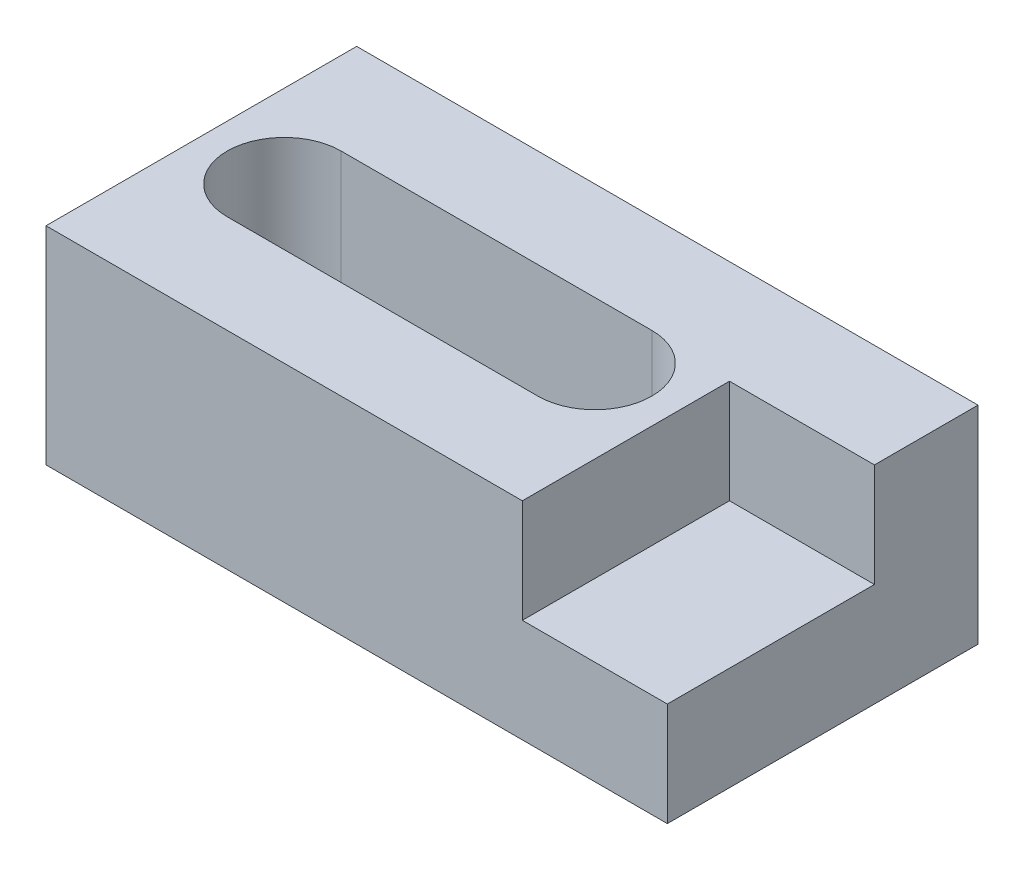
ISO-10303-21;
HEADER;
FILE_DESCRIPTION(('STEP AP214'),'2;1');
FILE_NAME('part.step','',(''),(''),'','','');
FILE_SCHEMA(('AUTOMOTIVE_DESIGN { 1 0 10303 214 1 1 1 1 }'));
ENDSEC;
DATA;
#1=APPLICATION_CONTEXT('core data for automotive mechanical design processes');
#2=APPLICATION_PROTOCOL_DEFINITION('international standard','automotive_design',2000,#1);
#3=PRODUCT_CONTEXT('',#1,'mechanical');
#4=PRODUCT('Part','Part','',(#3));
#5=PRODUCT_RELATED_PRODUCT_CATEGORY('part','',(#4));
#6=PRODUCT_DEFINITION_FORMATION('','',#4);
#7=PRODUCT_DEFINITION_CONTEXT('part definition',#1,'design');
#8=PRODUCT_DEFINITION('design','',#6,#7);
#9=PRODUCT_DEFINITION_SHAPE('','',#8);
#10=(LENGTH_UNIT() NAMED_UNIT(*) SI_UNIT(.MILLI.,.METRE.));
#11=(NAMED_UNIT(*) PLANE_ANGLE_UNIT() SI_UNIT($,.RADIAN.));
#12=(NAMED_UNIT(*) SI_UNIT($,.STERADIAN.) SOLID_ANGLE_UNIT());
#13=UNCERTAINTY_MEASURE_WITH_UNIT(LENGTH_MEASURE(1.E-05),#10,'distance_accuracy_value','');
#14=(GEOMETRIC_REPRESENTATION_CONTEXT(3) GLOBAL_UNCERTAINTY_ASSIGNED_CONTEXT((#13)) GLOBAL_UNIT_ASSIGNED_CONTEXT((#10,
#11,#12)) REPRESENTATION_CONTEXT('',''));
#15=CARTESIAN_POINT('',(0.,0.,0.));
#16=DIRECTION('',(0.,0.,1.));
#17=DIRECTION('',(1.,0.,0.));
#18=AXIS2_PLACEMENT_3D('',#15,#16,#17);
#19=CARTESIAN_POINT('',(15.,5.,-7.5));
#20=DIRECTION('',(0.,-1.,0.));
#21=DIRECTION('',(1.,0.,0.));
#22=AXIS2_PLACEMENT_3D('',#19,#20,#21);
#23=PLANE('',#22);
#24=DIRECTION('',(1.,0.,0.));
#25=VECTOR('',#24,1.);
#26=CARTESIAN_POINT('',(15.,5.,-2.5));
#27=LINE('',#26,#25);
#28=CARTESIAN_POINT('',(8.,5.,-2.5));
#29=VERTEX_POINT('',#28);
#30=CARTESIAN_POINT('',(15.,5.,-2.5));
#31=VERTEX_POINT('',#30);
#32=EDGE_CURVE('E53',#29,#31,#27,.T.);
#33=ORIENTED_EDGE('',*,*,#32,.F.);
#34=DIRECTION('',(0.,0.,1.));
#35=VECTOR('',#34,1.);
#36=CARTESIAN_POINT('',(8.,5.,-7.5));
#37=LINE('',#36,#35);
#38=CARTESIAN_POINT('',(8.,5.,7.5));
#39=VERTEX_POINT('',#38);
#40=EDGE_CURVE('E127',#29,#39,#37,.T.);
#41=ORIENTED_EDGE('',*,*,#40,.T.);
#42=DIRECTION('',(-1.,0.,0.));
#43=VECTOR('',#42,1.);
#44=CARTESIAN_POINT('',(-15.,5.,7.5));
#45=LINE('',#44,#43);
#46=CARTESIAN_POINT('',(15.,5.,7.5));
#47=VERTEX_POINT('',#46);
#48=EDGE_CURVE('E11',#47,#39,#45,.T.);
#49=ORIENTED_EDGE('',*,*,#48,.F.);
#50=DIRECTION('',(0.,0.,1.));
#51=VECTOR('',#50,1.);
#52=CARTESIAN_POINT('',(15.,5.,-7.5));
#53=LINE('',#52,#51);
#54=EDGE_CURVE('E48',#31,#47,#53,.T.);
#55=ORIENTED_EDGE('',*,*,#54,.F.);
#56=EDGE_LOOP('',(#33,#41,#49,#55));
#57=FACE_BOUND('',#56,.T.);
#58=ADVANCED_FACE('F33',(#57),#23,.F.);
#59=CARTESIAN_POINT('',(8.,10.,-7.5));
#60=DIRECTION('',(-1.,0.,0.));
#61=DIRECTION('',(0.,0.,1.));
#62=AXIS2_PLACEMENT_3D('',#59,#60,#61);
#63=PLANE('',#62);
#64=DIRECTION('',(0.,-1.,0.));
#65=VECTOR('',#64,1.);
#66=CARTESIAN_POINT('',(8.,18.6023252670426,-2.5));
#67=LINE('',#66,#65);
#68=CARTESIAN_POINT('',(8.,10.,-2.5));
#69=VERTEX_POINT('',#68);
#70=EDGE_CURVE('E131',#69,#29,#67,.T.);
#71=ORIENTED_EDGE('',*,*,#70,.F.);
#72=DIRECTION('',(0.,0.,1.));
#73=VECTOR('',#72,1.);
#74=CARTESIAN_POINT('',(8.,10.,-7.5));
#75=LINE('',#74,#73);
#76=CARTESIAN_POINT('',(8.,10.,7.5));
#77=VERTEX_POINT('',#76);
#78=EDGE_CURVE('E114',#69,#77,#75,.T.);
#79=ORIENTED_EDGE('',*,*,#78,.T.);
#80=DIRECTION('',(0.,1.,0.));
#81=VECTOR('',#80,1.);
#82=CARTESIAN_POINT('',(8.,10.,7.5));
#83=LINE('',#82,#81);
#84=EDGE_CURVE('E41',#39,#77,#83,.T.);
#85=ORIENTED_EDGE('',*,*,#84,.F.);
#86=ORIENTED_EDGE('',*,*,#40,.F.);
#87=EDGE_LOOP('',(#71,#79,#85,#86));
#88=FACE_BOUND('',#87,.T.);
#89=ADVANCED_FACE('F132',(#88),#63,.F.);
#90=CARTESIAN_POINT('',(0.,10.,0.));
#91=DIRECTION('',(0.,-1.,0.));
#92=DIRECTION('',(0.,0.,-1.));
#93=AXIS2_PLACEMENT_3D('',#90,#91,#92);
#94=PLANE('',#93);
#95=DIRECTION('',(1.,0.,0.));
#96=VECTOR('',#95,1.);
#97=CARTESIAN_POINT('',(-15.,10.,7.5));
#98=LINE('',#97,#96);
#99=CARTESIAN_POINT('',(-15.,10.,7.5));
#100=VERTEX_POINT('',#99);
#101=EDGE_CURVE('E123',#100,#77,#98,.T.);
#102=ORIENTED_EDGE('',*,*,#101,.T.);
#103=ORIENTED_EDGE('',*,*,#78,.F.);
#104=DIRECTION('',(-1.,0.,0.));
#105=VECTOR('',#104,1.);
#106=CARTESIAN_POINT('',(15.,10.,-2.5));
#107=LINE('',#106,#105);
#108=CARTESIAN_POINT('',(15.,10.,-2.5));
#109=VERTEX_POINT('',#108);
#110=EDGE_CURVE('E120',#109,#69,#107,.T.);
#111=ORIENTED_EDGE('',*,*,#110,.F.);
#112=DIRECTION('',(0.,0.,1.));
#113=VECTOR('',#112,1.);
#114=CARTESIAN_POINT('',(15.,10.,-7.5));
#115=LINE('',#114,#113);
#116=CARTESIAN_POINT('',(15.,10.,-7.5));
#117=VERTEX_POINT('',#116);
#118=EDGE_CURVE('E128',#117,#109,#115,.T.);
#119=ORIENTED_EDGE('',*,*,#118,.F.);
#120=DIRECTION('',(-1.,0.,0.));
#121=VECTOR('',#120,1.);
#122=CARTESIAN_POINT('',(-15.,10.,-7.5));
#123=LINE('',#122,#121);
#124=CARTESIAN_POINT('',(-15.,10.,-7.5));
#125=VERTEX_POINT('',#124);
#126=EDGE_CURVE('E176',#117,#125,#123,.T.);
#127=ORIENTED_EDGE('',*,*,#126,.T.);
#128=DIRECTION('',(0.,0.,1.));
#129=VECTOR('',#128,1.);
#130=CARTESIAN_POINT('',(-15.,10.,7.5));
#131=LINE('',#130,#129);
#132=EDGE_CURVE('E178',#125,#100,#131,.T.);
#133=ORIENTED_EDGE('',*,*,#132,.T.);
#134=EDGE_LOOP('',(#102,#103,#111,#119,#127,#133));
#135=FACE_BOUND('',#134,.T.);
#136=CARTESIAN_POINT('',(-11.,10.,0.));
#137=DIRECTION('',(0.,1.,0.));
#138=DIRECTION('',(0.,0.,1.));
#139=AXIS2_PLACEMENT_3D('',#136,#137,#138);
#140=CIRCLE('',#139,2.75);
#141=CARTESIAN_POINT('',(-11.,10.,-2.75));
#142=VERTEX_POINT('',#141);
#143=CARTESIAN_POINT('',(-11.,10.,2.75));
#144=VERTEX_POINT('',#143);
#145=EDGE_CURVE('E145',#142,#144,#140,.T.);
#146=ORIENTED_EDGE('',*,*,#145,.F.);
#147=DIRECTION('',(-1.,0.,0.));
#148=VECTOR('',#147,1.);
#149=CARTESIAN_POINT('',(-11.,10.,-2.75));
#150=LINE('',#149,#148);
#151=CARTESIAN_POINT('',(4.,10.,-2.75));
#152=VERTEX_POINT('',#151);
#153=EDGE_CURVE('E153',#152,#142,#150,.T.);
#154=ORIENTED_EDGE('',*,*,#153,.F.);
#155=CARTESIAN_POINT('',(4.,10.,0.));
#156=DIRECTION('',(0.,1.,0.));
#157=DIRECTION('',(0.,0.,1.));
#158=AXIS2_PLACEMENT_3D('',#155,#156,#157);
#159=CIRCLE('',#158,2.75);
#160=CARTESIAN_POINT('',(4.,10.,2.75));
#161=VERTEX_POINT('',#160);
#162=EDGE_CURVE('E150',#161,#152,#159,.T.);
#163=ORIENTED_EDGE('',*,*,#162,.F.);
#164=DIRECTION('',(1.,0.,0.));
#165=VECTOR('',#164,1.);
#166=CARTESIAN_POINT('',(-11.,10.,2.75));
#167=LINE('',#166,#165);
#168=EDGE_CURVE('E147',#144,#161,#167,.T.);
#169=ORIENTED_EDGE('',*,*,#168,.F.);
#170=EDGE_LOOP('',(#146,#154,#163,#169));
#171=FACE_BOUND('',#170,.T.);
#172=ADVANCED_FACE('F116',(#135,#171),#94,.F.);
#173=CARTESIAN_POINT('',(0.,0.,0.));
#174=DIRECTION('',(0.,-1.,0.));
#175=DIRECTION('',(0.,0.,-1.));
#176=AXIS2_PLACEMENT_3D('',#173,#174,#175);
#177=PLANE('',#176);
#178=DIRECTION('',(0.,0.,-1.));
#179=VECTOR('',#178,1.);
#180=CARTESIAN_POINT('',(15.,0.,7.5));
#181=LINE('',#180,#179);
#182=CARTESIAN_POINT('',(15.,0.,7.5));
#183=VERTEX_POINT('',#182);
#184=CARTESIAN_POINT('',(15.,0.,-7.5));
#185=VERTEX_POINT('',#184);
#186=EDGE_CURVE('E175',#183,#185,#181,.T.);
#187=ORIENTED_EDGE('',*,*,#186,.F.);
#188=DIRECTION('',(1.,0.,0.));
#189=VECTOR('',#188,1.);
#190=CARTESIAN_POINT('',(-15.,0.,7.5));
#191=LINE('',#190,#189);
#192=CARTESIAN_POINT('',(-15.,0.,7.5));
#193=VERTEX_POINT('',#192);
#194=EDGE_CURVE('E179',#193,#183,#191,.T.);
#195=ORIENTED_EDGE('',*,*,#194,.F.);
#196=DIRECTION('',(0.,0.,1.));
#197=VECTOR('',#196,1.);
#198=CARTESIAN_POINT('',(-15.,0.,7.5));
#199=LINE('',#198,#197);
#200=CARTESIAN_POINT('',(-15.,0.,-7.5));
#201=VERTEX_POINT('',#200);
#202=EDGE_CURVE('E187',#201,#193,#199,.T.);
#203=ORIENTED_EDGE('',*,*,#202,.F.);
#204=DIRECTION('',(-1.,0.,0.));
#205=VECTOR('',#204,1.);
#206=CARTESIAN_POINT('',(-15.,0.,-7.5));
#207=LINE('',#206,#205);
#208=EDGE_CURVE('E185',#185,#201,#207,.T.);
#209=ORIENTED_EDGE('',*,*,#208,.F.);
#210=EDGE_LOOP('',(#187,#195,#203,#209));
#211=FACE_BOUND('',#210,.T.);
#212=DIRECTION('',(-1.,0.,0.));
#213=VECTOR('',#212,1.);
#214=CARTESIAN_POINT('',(-11.,0.,-2.75));
#215=LINE('',#214,#213);
#216=CARTESIAN_POINT('',(4.,0.,-2.75));
#217=VERTEX_POINT('',#216);
#218=CARTESIAN_POINT('',(-11.,0.,-2.75));
#219=VERTEX_POINT('',#218);
#220=EDGE_CURVE('E148',#217,#219,#215,.T.);
#221=ORIENTED_EDGE('',*,*,#220,.T.);
#222=CARTESIAN_POINT('',(-11.,0.,0.));
#223=DIRECTION('',(0.,1.,0.));
#224=DIRECTION('',(0.,0.,1.));
#225=AXIS2_PLACEMENT_3D('',#222,#223,#224);
#226=CIRCLE('',#225,2.75);
#227=CARTESIAN_POINT('',(-11.,0.,2.75));
#228=VERTEX_POINT('',#227);
#229=EDGE_CURVE('E143',#219,#228,#226,.T.);
#230=ORIENTED_EDGE('',*,*,#229,.T.);
#231=DIRECTION('',(1.,0.,0.));
#232=VECTOR('',#231,1.);
#233=CARTESIAN_POINT('',(-11.,0.,2.75));
#234=LINE('',#233,#232);
#235=CARTESIAN_POINT('',(4.,0.,2.75));
#236=VERTEX_POINT('',#235);
#237=EDGE_CURVE('E158',#228,#236,#234,.T.);
#238=ORIENTED_EDGE('',*,*,#237,.T.);
#239=CARTESIAN_POINT('',(4.,0.,0.));
#240=DIRECTION('',(0.,1.,0.));
#241=DIRECTION('',(0.,0.,1.));
#242=AXIS2_PLACEMENT_3D('',#239,#240,#241);
#243=CIRCLE('',#242,2.75);
#244=EDGE_CURVE('E161',#236,#217,#243,.T.);
#245=ORIENTED_EDGE('',*,*,#244,.T.);
#246=EDGE_LOOP('',(#221,#230,#238,#245));
#247=FACE_BOUND('',#246,.T.);
#248=ADVANCED_FACE('F228',(#211,#247),#177,.T.);
#249=CARTESIAN_POINT('',(15.,10.,7.5));
#250=DIRECTION('',(-1.,0.,0.));
#251=DIRECTION('',(0.,0.,1.));
#252=AXIS2_PLACEMENT_3D('',#249,#250,#251);
#253=PLANE('',#252);
#254=DIRECTION('',(0.,-1.,0.));
#255=VECTOR('',#254,1.);
#256=CARTESIAN_POINT('',(15.,10.,-7.5));
#257=LINE('',#256,#255);
#258=EDGE_CURVE('E198',#117,#185,#257,.T.);
#259=ORIENTED_EDGE('',*,*,#258,.F.);
#260=ORIENTED_EDGE('',*,*,#118,.T.);
#261=DIRECTION('',(0.,-1.,0.));
#262=VECTOR('',#261,1.);
#263=CARTESIAN_POINT('',(15.,18.6023252670426,-2.5));
#264=LINE('',#263,#262);
#265=EDGE_CURVE('E134',#109,#31,#264,.T.);
#266=ORIENTED_EDGE('',*,*,#265,.T.);
#267=ORIENTED_EDGE('',*,*,#54,.T.);
#268=DIRECTION('',(0.,-1.,0.));
#269=VECTOR('',#268,1.);
#270=CARTESIAN_POINT('',(15.,10.,7.5));
#271=LINE('',#270,#269);
#272=EDGE_CURVE('E182',#47,#183,#271,.T.);
#273=ORIENTED_EDGE('',*,*,#272,.T.);
#274=ORIENTED_EDGE('',*,*,#186,.T.);
#275=EDGE_LOOP('',(#259,#260,#266,#267,#273,#274));
#276=FACE_BOUND('',#275,.T.);
#277=ADVANCED_FACE('F35',(#276),#253,.F.);
#278=CARTESIAN_POINT('',(-15.,10.,-7.5));
#279=DIRECTION('',(0.,0.,1.));
#280=DIRECTION('',(1.,0.,0.));
#281=AXIS2_PLACEMENT_3D('',#278,#279,#280);
#282=PLANE('',#281);
#283=ORIENTED_EDGE('',*,*,#126,.F.);
#284=ORIENTED_EDGE('',*,*,#258,.T.);
#285=ORIENTED_EDGE('',*,*,#208,.T.);
#286=DIRECTION('',(0.,-1.,0.));
#287=VECTOR('',#286,1.);
#288=CARTESIAN_POINT('',(-15.,10.,-7.5));
#289=LINE('',#288,#287);
#290=EDGE_CURVE('E195',#125,#201,#289,.T.);
#291=ORIENTED_EDGE('',*,*,#290,.F.);
#292=EDGE_LOOP('',(#283,#284,#285,#291));
#293=FACE_BOUND('',#292,.T.);
#294=ADVANCED_FACE('F236',(#293),#282,.F.);
#295=CARTESIAN_POINT('',(-15.,10.,7.5));
#296=DIRECTION('',(1.,0.,0.));
#297=DIRECTION('',(0.,0.,-1.));
#298=AXIS2_PLACEMENT_3D('',#295,#296,#297);
#299=PLANE('',#298);
#300=ORIENTED_EDGE('',*,*,#202,.T.);
#301=DIRECTION('',(0.,-1.,0.));
#302=VECTOR('',#301,1.);
#303=CARTESIAN_POINT('',(-15.,10.,7.5));
#304=LINE('',#303,#302);
#305=EDGE_CURVE('E192',#100,#193,#304,.T.);
#306=ORIENTED_EDGE('',*,*,#305,.F.);
#307=ORIENTED_EDGE('',*,*,#132,.F.);
#308=ORIENTED_EDGE('',*,*,#290,.T.);
#309=EDGE_LOOP('',(#300,#306,#307,#308));
#310=FACE_BOUND('',#309,.T.);
#311=ADVANCED_FACE('F234',(#310),#299,.F.);
#312=CARTESIAN_POINT('',(-15.,10.,7.5));
#313=DIRECTION('',(0.,0.,-1.));
#314=DIRECTION('',(-1.,0.,0.));
#315=AXIS2_PLACEMENT_3D('',#312,#313,#314);
#316=PLANE('',#315);
#317=ORIENTED_EDGE('',*,*,#272,.F.);
#318=ORIENTED_EDGE('',*,*,#48,.T.);
#319=ORIENTED_EDGE('',*,*,#84,.T.);
#320=ORIENTED_EDGE('',*,*,#101,.F.);
#321=ORIENTED_EDGE('',*,*,#305,.T.);
#322=ORIENTED_EDGE('',*,*,#194,.T.);
#323=EDGE_LOOP('',(#317,#318,#319,#320,#321,#322));
#324=FACE_BOUND('',#323,.T.);
#325=ADVANCED_FACE('F201',(#324),#316,.F.);
#326=CARTESIAN_POINT('',(-11.,10.,0.));
#327=DIRECTION('',(0.,-1.,0.));
#328=DIRECTION('',(0.,0.,-1.));
#329=AXIS2_PLACEMENT_3D('',#326,#327,#328);
#330=CYLINDRICAL_SURFACE('',#329,2.75);
#331=ORIENTED_EDGE('',*,*,#229,.F.);
#332=DIRECTION('',(0.,-1.,0.));
#333=VECTOR('',#332,1.);
#334=CARTESIAN_POINT('',(-11.,10.,-2.75));
#335=LINE('',#334,#333);
#336=EDGE_CURVE('E155',#142,#219,#335,.T.);
#337=ORIENTED_EDGE('',*,*,#336,.F.);
#338=ORIENTED_EDGE('',*,*,#145,.T.);
#339=DIRECTION('',(0.,-1.,0.));
#340=VECTOR('',#339,1.);
#341=CARTESIAN_POINT('',(-11.,10.,2.75));
#342=LINE('',#341,#340);
#343=EDGE_CURVE('E172',#144,#228,#342,.T.);
#344=ORIENTED_EDGE('',*,*,#343,.T.);
#345=EDGE_LOOP('',(#331,#337,#338,#344));
#346=FACE_BOUND('',#345,.T.);
#347=ADVANCED_FACE('F221',(#346),#330,.F.);
#348=CARTESIAN_POINT('',(-11.,10.,2.75));
#349=DIRECTION('',(0.,0.,-1.));
#350=DIRECTION('',(-1.,0.,0.));
#351=AXIS2_PLACEMENT_3D('',#348,#349,#350);
#352=PLANE('',#351);
#353=ORIENTED_EDGE('',*,*,#237,.F.);
#354=ORIENTED_EDGE('',*,*,#343,.F.);
#355=ORIENTED_EDGE('',*,*,#168,.T.);
#356=DIRECTION('',(0.,-1.,0.));
#357=VECTOR('',#356,1.);
#358=CARTESIAN_POINT('',(4.,10.,2.75));
#359=LINE('',#358,#357);
#360=EDGE_CURVE('E170',#161,#236,#359,.T.);
#361=ORIENTED_EDGE('',*,*,#360,.T.);
#362=EDGE_LOOP('',(#353,#354,#355,#361));
#363=FACE_BOUND('',#362,.T.);
#364=ADVANCED_FACE('F217',(#363),#352,.T.);
#365=CARTESIAN_POINT('',(4.,10.,0.));
#366=DIRECTION('',(0.,-1.,0.));
#367=DIRECTION('',(0.,0.,-1.));
#368=AXIS2_PLACEMENT_3D('',#365,#366,#367);
#369=CYLINDRICAL_SURFACE('',#368,2.75);
#370=ORIENTED_EDGE('',*,*,#244,.F.);
#371=ORIENTED_EDGE('',*,*,#360,.F.);
#372=ORIENTED_EDGE('',*,*,#162,.T.);
#373=DIRECTION('',(0.,-1.,0.));
#374=VECTOR('',#373,1.);
#375=CARTESIAN_POINT('',(4.,10.,-2.75));
#376=LINE('',#375,#374);
#377=EDGE_CURVE('E168',#152,#217,#376,.T.);
#378=ORIENTED_EDGE('',*,*,#377,.T.);
#379=EDGE_LOOP('',(#370,#371,#372,#378));
#380=FACE_BOUND('',#379,.T.);
#381=ADVANCED_FACE('F213',(#380),#369,.F.);
#382=CARTESIAN_POINT('',(-11.,10.,-2.75));
#383=DIRECTION('',(0.,0.,1.));
#384=DIRECTION('',(1.,0.,0.));
#385=AXIS2_PLACEMENT_3D('',#382,#383,#384);
#386=PLANE('',#385);
#387=ORIENTED_EDGE('',*,*,#220,.F.);
#388=ORIENTED_EDGE('',*,*,#377,.F.);
#389=ORIENTED_EDGE('',*,*,#153,.T.);
#390=ORIENTED_EDGE('',*,*,#336,.T.);
#391=EDGE_LOOP('',(#387,#388,#389,#390));
#392=FACE_BOUND('',#391,.T.);
#393=ADVANCED_FACE('F210',(#392),#386,.T.);
#394=CARTESIAN_POINT('',(15.,18.6023252670426,-2.5));
#395=DIRECTION('',(0.,0.,-1.));
#396=DIRECTION('',(-1.,0.,0.));
#397=AXIS2_PLACEMENT_3D('',#394,#395,#396);
#398=PLANE('',#397);
#399=ORIENTED_EDGE('',*,*,#265,.F.);
#400=ORIENTED_EDGE('',*,*,#110,.T.);
#401=ORIENTED_EDGE('',*,*,#70,.T.);
#402=ORIENTED_EDGE('',*,*,#32,.T.);
#403=EDGE_LOOP('',(#399,#400,#401,#402));
#404=FACE_BOUND('',#403,.T.);
#405=ADVANCED_FACE('F137',(#404),#398,.F.);
#406=CLOSED_SHELL('',(#58,#89,#172,#248,#277,#294,#311,#325,#347,#364,#381,#393,#405));
#407=MANIFOLD_SOLID_BREP('B2',#406);
#408=ADVANCED_BREP_SHAPE_REPRESENTATION('',(#18,#407),#14);
#409=SHAPE_DEFINITION_REPRESENTATION(#9,#408);
ENDSEC;
END-ISO-10303-21;
